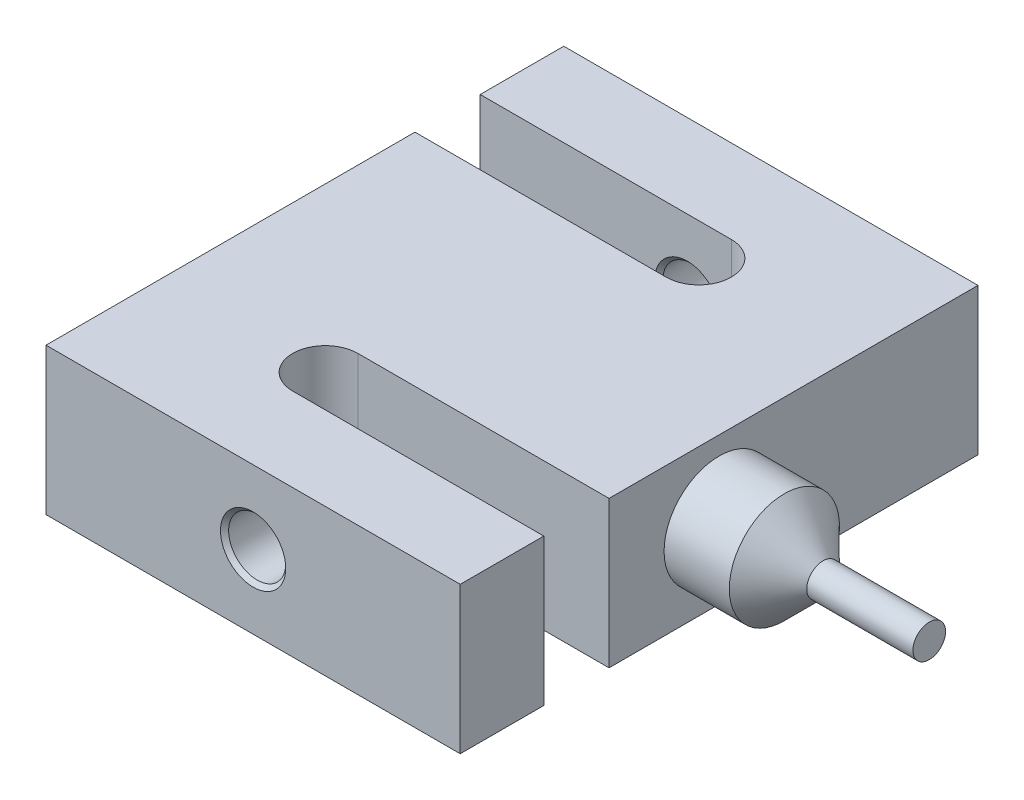
ISO-10303-21;
HEADER;
FILE_DESCRIPTION(('STEP AP214'),'2;1');
FILE_NAME('part.step','',(''),(''),'','','');
FILE_SCHEMA(('AUTOMOTIVE_DESIGN { 1 0 10303 214 1 1 1 1 }'));
ENDSEC;
DATA;
#1=APPLICATION_CONTEXT('core data for automotive mechanical design processes');
#2=APPLICATION_PROTOCOL_DEFINITION('international standard','automotive_design',2000,#1);
#3=PRODUCT_CONTEXT('',#1,'mechanical');
#4=PRODUCT('Part','Part','',(#3));
#5=PRODUCT_RELATED_PRODUCT_CATEGORY('part','',(#4));
#6=PRODUCT_DEFINITION_FORMATION('','',#4);
#7=PRODUCT_DEFINITION_CONTEXT('part definition',#1,'design');
#8=PRODUCT_DEFINITION('design','',#6,#7);
#9=PRODUCT_DEFINITION_SHAPE('','',#8);
#10=(LENGTH_UNIT() NAMED_UNIT(*) SI_UNIT(.MILLI.,.METRE.));
#11=(NAMED_UNIT(*) PLANE_ANGLE_UNIT() SI_UNIT($,.RADIAN.));
#12=(NAMED_UNIT(*) SI_UNIT($,.STERADIAN.) SOLID_ANGLE_UNIT());
#13=UNCERTAINTY_MEASURE_WITH_UNIT(LENGTH_MEASURE(1.E-05),#10,'distance_accuracy_value','');
#14=(GEOMETRIC_REPRESENTATION_CONTEXT(3) GLOBAL_UNCERTAINTY_ASSIGNED_CONTEXT((#13)) GLOBAL_UNIT_ASSIGNED_CONTEXT((#10,
#11,#12)) REPRESENTATION_CONTEXT('',''));
#15=CARTESIAN_POINT('',(0.,0.,0.));
#16=DIRECTION('',(0.,0.,1.));
#17=DIRECTION('',(1.,0.,0.));
#18=AXIS2_PLACEMENT_3D('',#15,#16,#17);
#19=CARTESIAN_POINT('',(25.4,9.,-31.75));
#20=DIRECTION('',(0.,0.,1.));
#21=DIRECTION('',(1.,0.,0.));
#22=AXIS2_PLACEMENT_3D('',#19,#20,#21);
#23=PLANE('',#22);
#24=DIRECTION('',(-1.,0.,0.));
#25=VECTOR('',#24,1.);
#26=CARTESIAN_POINT('',(25.4,-9.,-31.75));
#27=LINE('',#26,#25);
#28=CARTESIAN_POINT('',(25.4,-9.,-31.75));
#29=VERTEX_POINT('',#28);
#30=CARTESIAN_POINT('',(-25.4,-9.,-31.75));
#31=VERTEX_POINT('',#30);
#32=EDGE_CURVE('E131',#29,#31,#27,.T.);
#33=ORIENTED_EDGE('',*,*,#32,.T.);
#34=DIRECTION('',(0.,-1.,0.));
#35=VECTOR('',#34,1.);
#36=CARTESIAN_POINT('',(-25.4,9.,-31.75));
#37=LINE('',#36,#35);
#38=CARTESIAN_POINT('',(-25.4,9.,-31.75));
#39=VERTEX_POINT('',#38);
#40=EDGE_CURVE('E142',#39,#31,#37,.T.);
#41=ORIENTED_EDGE('',*,*,#40,.F.);
#42=DIRECTION('',(-1.,0.,0.));
#43=VECTOR('',#42,1.);
#44=CARTESIAN_POINT('',(25.4,9.,-31.75));
#45=LINE('',#44,#43);
#46=CARTESIAN_POINT('',(25.4,9.,-31.75));
#47=VERTEX_POINT('',#46);
#48=EDGE_CURVE('E150',#47,#39,#45,.T.);
#49=ORIENTED_EDGE('',*,*,#48,.F.);
#50=DIRECTION('',(0.,-1.,0.));
#51=VECTOR('',#50,1.);
#52=CARTESIAN_POINT('',(25.4,9.,-31.75));
#53=LINE('',#52,#51);
#54=EDGE_CURVE('E44',#47,#29,#53,.T.);
#55=ORIENTED_EDGE('',*,*,#54,.T.);
#56=EDGE_LOOP('',(#33,#41,#49,#55));
#57=FACE_BOUND('',#56,.T.);
#58=CARTESIAN_POINT('',(0.,0.,-31.75));
#59=DIRECTION('',(0.,0.,-1.));
#60=DIRECTION('',(-1.,0.,0.));
#61=AXIS2_PLACEMENT_3D('',#58,#59,#60);
#62=CIRCLE('',#61,4.);
#63=CARTESIAN_POINT('',(-4.,0.,-31.75));
#64=VERTEX_POINT('',#63);
#65=EDGE_CURVE('E170',#64,#64,#62,.T.);
#66=ORIENTED_EDGE('',*,*,#65,.F.);
#67=EDGE_LOOP('',(#66));
#68=FACE_BOUND('',#67,.T.);
#69=ADVANCED_FACE('F35',(#57,#68),#23,.F.);
#70=CARTESIAN_POINT('',(-25.4,9.,-13.5));
#71=DIRECTION('',(1.,0.,0.));
#72=DIRECTION('',(0.,0.,-1.));
#73=AXIS2_PLACEMENT_3D('',#70,#71,#72);
#74=PLANE('',#73);
#75=DIRECTION('',(0.,0.,1.));
#76=VECTOR('',#75,1.);
#77=CARTESIAN_POINT('',(-25.4,-9.,-13.5));
#78=LINE('',#77,#76);
#79=CARTESIAN_POINT('',(-25.4,-9.,-13.5));
#80=VERTEX_POINT('',#79);
#81=CARTESIAN_POINT('',(-25.4,-9.,31.75));
#82=VERTEX_POINT('',#81);
#83=EDGE_CURVE('E125',#80,#82,#78,.T.);
#84=ORIENTED_EDGE('',*,*,#83,.T.);
#85=DIRECTION('',(0.,-1.,0.));
#86=VECTOR('',#85,1.);
#87=CARTESIAN_POINT('',(-25.4,9.,31.75));
#88=LINE('',#87,#86);
#89=CARTESIAN_POINT('',(-25.4,9.,31.75));
#90=VERTEX_POINT('',#89);
#91=EDGE_CURVE('E176',#90,#82,#88,.T.);
#92=ORIENTED_EDGE('',*,*,#91,.F.);
#93=DIRECTION('',(0.,0.,1.));
#94=VECTOR('',#93,1.);
#95=CARTESIAN_POINT('',(-25.4,9.,-13.5));
#96=LINE('',#95,#94);
#97=CARTESIAN_POINT('',(-25.4,9.,-13.5));
#98=VERTEX_POINT('',#97);
#99=EDGE_CURVE('E138',#98,#90,#96,.T.);
#100=ORIENTED_EDGE('',*,*,#99,.F.);
#101=DIRECTION('',(0.,-1.,0.));
#102=VECTOR('',#101,1.);
#103=CARTESIAN_POINT('',(-25.4,9.,-13.5));
#104=LINE('',#103,#102);
#105=EDGE_CURVE('E121',#98,#80,#104,.T.);
#106=ORIENTED_EDGE('',*,*,#105,.T.);
#107=EDGE_LOOP('',(#84,#92,#100,#106));
#108=FACE_BOUND('',#107,.T.);
#109=ADVANCED_FACE('F37',(#108),#74,.F.);
#110=CARTESIAN_POINT('',(25.4,9.,0.));
#111=DIRECTION('',(-1.,0.,0.));
#112=DIRECTION('',(0.,0.,1.));
#113=AXIS2_PLACEMENT_3D('',#110,#111,#112);
#114=PLANE('',#113);
#115=CARTESIAN_POINT('',(25.4,0.,0.));
#116=DIRECTION('',(-1.,0.,0.));
#117=DIRECTION('',(0.,0.,1.));
#118=AXIS2_PLACEMENT_3D('',#115,#116,#117);
#119=CIRCLE('',#118,6.75);
#120=CARTESIAN_POINT('',(25.4,0.,6.75));
#121=VERTEX_POINT('',#120);
#122=EDGE_CURVE('E11',#121,#121,#119,.F.);
#123=ORIENTED_EDGE('',*,*,#122,.F.);
#124=EDGE_LOOP('',(#123));
#125=FACE_BOUND('',#124,.T.);
#126=DIRECTION('',(0.,0.,-1.));
#127=VECTOR('',#126,1.);
#128=CARTESIAN_POINT('',(25.4,-9.,0.));
#129=LINE('',#128,#127);
#130=CARTESIAN_POINT('',(25.4,-9.,13.5));
#131=VERTEX_POINT('',#130);
#132=EDGE_CURVE('E128',#131,#29,#129,.T.);
#133=ORIENTED_EDGE('',*,*,#132,.T.);
#134=ORIENTED_EDGE('',*,*,#54,.F.);
#135=DIRECTION('',(0.,0.,-1.));
#136=VECTOR('',#135,1.);
#137=CARTESIAN_POINT('',(25.4,9.,0.));
#138=LINE('',#137,#136);
#139=CARTESIAN_POINT('',(25.4,9.,13.5));
#140=VERTEX_POINT('',#139);
#141=EDGE_CURVE('E90',#140,#47,#138,.T.);
#142=ORIENTED_EDGE('',*,*,#141,.F.);
#143=DIRECTION('',(0.,-1.,0.));
#144=VECTOR('',#143,1.);
#145=CARTESIAN_POINT('',(25.4,9.,13.5));
#146=LINE('',#145,#144);
#147=EDGE_CURVE('E191',#140,#131,#146,.T.);
#148=ORIENTED_EDGE('',*,*,#147,.T.);
#149=EDGE_LOOP('',(#133,#134,#142,#148));
#150=FACE_BOUND('',#149,.T.);
#151=ADVANCED_FACE('F273',(#125,#150),#114,.F.);
#152=CARTESIAN_POINT('',(-25.4,9.,-31.75));
#153=DIRECTION('',(1.,0.,0.));
#154=DIRECTION('',(0.,0.,-1.));
#155=AXIS2_PLACEMENT_3D('',#152,#153,#154);
#156=PLANE('',#155);
#157=DIRECTION('',(0.,0.,1.));
#158=VECTOR('',#157,1.);
#159=CARTESIAN_POINT('',(-25.4,-9.,-31.75));
#160=LINE('',#159,#158);
#161=CARTESIAN_POINT('',(-25.4,-9.,-21.5));
#162=VERTEX_POINT('',#161);
#163=EDGE_CURVE('E133',#31,#162,#160,.T.);
#164=ORIENTED_EDGE('',*,*,#163,.T.);
#165=DIRECTION('',(0.,-1.,0.));
#166=VECTOR('',#165,1.);
#167=CARTESIAN_POINT('',(-25.4,9.,-21.5));
#168=LINE('',#167,#166);
#169=CARTESIAN_POINT('',(-25.4,9.,-21.5));
#170=VERTEX_POINT('',#169);
#171=EDGE_CURVE('E116',#170,#162,#168,.T.);
#172=ORIENTED_EDGE('',*,*,#171,.F.);
#173=DIRECTION('',(0.,0.,1.));
#174=VECTOR('',#173,1.);
#175=CARTESIAN_POINT('',(-25.4,9.,-31.75));
#176=LINE('',#175,#174);
#177=EDGE_CURVE('E107',#39,#170,#176,.T.);
#178=ORIENTED_EDGE('',*,*,#177,.F.);
#179=ORIENTED_EDGE('',*,*,#40,.T.);
#180=EDGE_LOOP('',(#164,#172,#178,#179));
#181=FACE_BOUND('',#180,.T.);
#182=ADVANCED_FACE('F160',(#181),#156,.F.);
#183=CARTESIAN_POINT('',(-25.4,9.,-21.5));
#184=DIRECTION('',(0.,0.,-1.));
#185=DIRECTION('',(-1.,0.,0.));
#186=AXIS2_PLACEMENT_3D('',#183,#184,#185);
#187=PLANE('',#186);
#188=CARTESIAN_POINT('',(0.,0.,-21.5));
#189=DIRECTION('',(0.,0.,-1.));
#190=DIRECTION('',(-1.,0.,0.));
#191=AXIS2_PLACEMENT_3D('',#188,#189,#190);
#192=CIRCLE('',#191,4.);
#193=CARTESIAN_POINT('',(-4.,0.,-21.5));
#194=VERTEX_POINT('',#193);
#195=EDGE_CURVE('E173',#194,#194,#192,.T.);
#196=ORIENTED_EDGE('',*,*,#195,.T.);
#197=EDGE_LOOP('',(#196));
#198=FACE_BOUND('',#197,.T.);
#199=DIRECTION('',(1.,0.,0.));
#200=VECTOR('',#199,1.);
#201=CARTESIAN_POINT('',(-25.4,-9.,-21.5));
#202=LINE('',#201,#200);
#203=CARTESIAN_POINT('',(5.4,-9.,-21.5));
#204=VERTEX_POINT('',#203);
#205=EDGE_CURVE('E115',#162,#204,#202,.T.);
#206=ORIENTED_EDGE('',*,*,#205,.T.);
#207=DIRECTION('',(0.,-1.,0.));
#208=VECTOR('',#207,1.);
#209=CARTESIAN_POINT('',(5.4,9.,-21.5));
#210=LINE('',#209,#208);
#211=CARTESIAN_POINT('',(5.4,9.,-21.5));
#212=VERTEX_POINT('',#211);
#213=EDGE_CURVE('E112',#212,#204,#210,.T.);
#214=ORIENTED_EDGE('',*,*,#213,.F.);
#215=DIRECTION('',(1.,0.,0.));
#216=VECTOR('',#215,1.);
#217=CARTESIAN_POINT('',(-25.4,9.,-21.5));
#218=LINE('',#217,#216);
#219=EDGE_CURVE('E101',#170,#212,#218,.T.);
#220=ORIENTED_EDGE('',*,*,#219,.F.);
#221=ORIENTED_EDGE('',*,*,#171,.T.);
#222=EDGE_LOOP('',(#206,#214,#220,#221));
#223=FACE_BOUND('',#222,.T.);
#224=ADVANCED_FACE('F113',(#198,#223),#187,.F.);
#225=CARTESIAN_POINT('',(5.4,9.,-17.5));
#226=DIRECTION('',(0.,-1.,0.));
#227=DIRECTION('',(0.,0.,-1.));
#228=AXIS2_PLACEMENT_3D('',#225,#226,#227);
#229=CYLINDRICAL_SURFACE('',#228,4.);
#230=CARTESIAN_POINT('',(5.4,-9.,-17.5));
#231=DIRECTION('',(0.,-1.,0.));
#232=DIRECTION('',(0.,0.,-1.));
#233=AXIS2_PLACEMENT_3D('',#230,#231,#232);
#234=CIRCLE('',#233,4.);
#235=CARTESIAN_POINT('',(5.4,-9.,-13.5));
#236=VERTEX_POINT('',#235);
#237=EDGE_CURVE('E76',#204,#236,#234,.T.);
#238=ORIENTED_EDGE('',*,*,#237,.T.);
#239=DIRECTION('',(0.,-1.,0.));
#240=VECTOR('',#239,1.);
#241=CARTESIAN_POINT('',(5.4,9.,-13.5));
#242=LINE('',#241,#240);
#243=CARTESIAN_POINT('',(5.4,9.,-13.5));
#244=VERTEX_POINT('',#243);
#245=EDGE_CURVE('E117',#244,#236,#242,.T.);
#246=ORIENTED_EDGE('',*,*,#245,.F.);
#247=CARTESIAN_POINT('',(5.4,9.,-17.5));
#248=DIRECTION('',(0.,-1.,0.));
#249=DIRECTION('',(0.,0.,-1.));
#250=AXIS2_PLACEMENT_3D('',#247,#248,#249);
#251=CIRCLE('',#250,4.);
#252=EDGE_CURVE('E105',#212,#244,#251,.T.);
#253=ORIENTED_EDGE('',*,*,#252,.F.);
#254=ORIENTED_EDGE('',*,*,#213,.T.);
#255=EDGE_LOOP('',(#238,#246,#253,#254));
#256=FACE_BOUND('',#255,.T.);
#257=ADVANCED_FACE('F119',(#256),#229,.F.);
#258=CARTESIAN_POINT('',(5.4,9.,-13.5));
#259=DIRECTION('',(0.,0.,1.));
#260=DIRECTION('',(1.,0.,0.));
#261=AXIS2_PLACEMENT_3D('',#258,#259,#260);
#262=PLANE('',#261);
#263=DIRECTION('',(-1.,0.,0.));
#264=VECTOR('',#263,1.);
#265=CARTESIAN_POINT('',(5.4,-9.,-13.5));
#266=LINE('',#265,#264);
#267=EDGE_CURVE('E82',#236,#80,#266,.T.);
#268=ORIENTED_EDGE('',*,*,#267,.T.);
#269=ORIENTED_EDGE('',*,*,#105,.F.);
#270=DIRECTION('',(-1.,0.,0.));
#271=VECTOR('',#270,1.);
#272=CARTESIAN_POINT('',(5.4,9.,-13.5));
#273=LINE('',#272,#271);
#274=EDGE_CURVE('E52',#244,#98,#273,.T.);
#275=ORIENTED_EDGE('',*,*,#274,.F.);
#276=ORIENTED_EDGE('',*,*,#245,.T.);
#277=EDGE_LOOP('',(#268,#269,#275,#276));
#278=FACE_BOUND('',#277,.T.);
#279=ADVANCED_FACE('F353',(#278),#262,.F.);
#280=CARTESIAN_POINT('',(5.4,9.,-17.5));
#281=DIRECTION('',(0.,-1.,0.));
#282=DIRECTION('',(0.,0.,-1.));
#283=AXIS2_PLACEMENT_3D('',#280,#281,#282);
#284=PLANE('',#283);
#285=ORIENTED_EDGE('',*,*,#99,.T.);
#286=DIRECTION('',(1.,0.,0.));
#287=VECTOR('',#286,1.);
#288=CARTESIAN_POINT('',(-25.4,9.,31.75));
#289=LINE('',#288,#287);
#290=CARTESIAN_POINT('',(25.4,9.,31.75));
#291=VERTEX_POINT('',#290);
#292=EDGE_CURVE('E197',#90,#291,#289,.T.);
#293=ORIENTED_EDGE('',*,*,#292,.T.);
#294=DIRECTION('',(0.,0.,-1.));
#295=VECTOR('',#294,1.);
#296=CARTESIAN_POINT('',(25.4,9.,31.75));
#297=LINE('',#296,#295);
#298=CARTESIAN_POINT('',(25.4,9.,21.5));
#299=VERTEX_POINT('',#298);
#300=EDGE_CURVE('E218',#291,#299,#297,.T.);
#301=ORIENTED_EDGE('',*,*,#300,.T.);
#302=DIRECTION('',(-1.,0.,0.));
#303=VECTOR('',#302,1.);
#304=CARTESIAN_POINT('',(25.4,9.,21.5));
#305=LINE('',#304,#303);
#306=CARTESIAN_POINT('',(-5.4,9.,21.5));
#307=VERTEX_POINT('',#306);
#308=EDGE_CURVE('E215',#299,#307,#305,.T.);
#309=ORIENTED_EDGE('',*,*,#308,.T.);
#310=CARTESIAN_POINT('',(-5.4,9.,17.5));
#311=DIRECTION('',(0.,-1.,0.));
#312=DIRECTION('',(0.,0.,1.));
#313=AXIS2_PLACEMENT_3D('',#310,#311,#312);
#314=CIRCLE('',#313,4.);
#315=CARTESIAN_POINT('',(-5.4,9.,13.5));
#316=VERTEX_POINT('',#315);
#317=EDGE_CURVE('E212',#307,#316,#314,.T.);
#318=ORIENTED_EDGE('',*,*,#317,.T.);
#319=DIRECTION('',(1.,0.,0.));
#320=VECTOR('',#319,1.);
#321=CARTESIAN_POINT('',(-5.4,9.,13.5));
#322=LINE('',#321,#320);
#323=EDGE_CURVE('E194',#316,#140,#322,.T.);
#324=ORIENTED_EDGE('',*,*,#323,.T.);
#325=ORIENTED_EDGE('',*,*,#141,.T.);
#326=ORIENTED_EDGE('',*,*,#48,.T.);
#327=ORIENTED_EDGE('',*,*,#177,.T.);
#328=ORIENTED_EDGE('',*,*,#219,.T.);
#329=ORIENTED_EDGE('',*,*,#252,.T.);
#330=ORIENTED_EDGE('',*,*,#274,.T.);
#331=EDGE_LOOP('',(#285,#293,#301,#309,#318,#324,#325,#326,#327,#328,#329,#330));
#332=FACE_BOUND('',#331,.T.);
#333=ADVANCED_FACE('F103',(#332),#284,.F.);
#334=CARTESIAN_POINT('',(5.4,-9.,-17.5));
#335=DIRECTION('',(0.,-1.,0.));
#336=DIRECTION('',(0.,0.,-1.));
#337=AXIS2_PLACEMENT_3D('',#334,#335,#336);
#338=PLANE('',#337);
#339=ORIENTED_EDGE('',*,*,#83,.F.);
#340=ORIENTED_EDGE('',*,*,#267,.F.);
#341=ORIENTED_EDGE('',*,*,#237,.F.);
#342=ORIENTED_EDGE('',*,*,#205,.F.);
#343=ORIENTED_EDGE('',*,*,#163,.F.);
#344=ORIENTED_EDGE('',*,*,#32,.F.);
#345=ORIENTED_EDGE('',*,*,#132,.F.);
#346=DIRECTION('',(1.,0.,0.));
#347=VECTOR('',#346,1.);
#348=CARTESIAN_POINT('',(-5.4,-9.,13.5));
#349=LINE('',#348,#347);
#350=CARTESIAN_POINT('',(-5.4,-9.,13.5));
#351=VERTEX_POINT('',#350);
#352=EDGE_CURVE('E195',#351,#131,#349,.T.);
#353=ORIENTED_EDGE('',*,*,#352,.F.);
#354=CARTESIAN_POINT('',(-5.4,-9.,17.5));
#355=DIRECTION('',(0.,-1.,0.));
#356=DIRECTION('',(0.,0.,1.));
#357=AXIS2_PLACEMENT_3D('',#354,#355,#356);
#358=CIRCLE('',#357,4.);
#359=CARTESIAN_POINT('',(-5.4,-9.,21.5));
#360=VERTEX_POINT('',#359);
#361=EDGE_CURVE('E198',#360,#351,#358,.T.);
#362=ORIENTED_EDGE('',*,*,#361,.F.);
#363=DIRECTION('',(-1.,0.,0.));
#364=VECTOR('',#363,1.);
#365=CARTESIAN_POINT('',(25.4,-9.,21.5));
#366=LINE('',#365,#364);
#367=CARTESIAN_POINT('',(25.4,-9.,21.5));
#368=VERTEX_POINT('',#367);
#369=EDGE_CURVE('E201',#368,#360,#366,.T.);
#370=ORIENTED_EDGE('',*,*,#369,.F.);
#371=DIRECTION('',(0.,0.,-1.));
#372=VECTOR('',#371,1.);
#373=CARTESIAN_POINT('',(25.4,-9.,31.75));
#374=LINE('',#373,#372);
#375=CARTESIAN_POINT('',(25.4,-9.,31.75));
#376=VERTEX_POINT('',#375);
#377=EDGE_CURVE('E204',#376,#368,#374,.T.);
#378=ORIENTED_EDGE('',*,*,#377,.F.);
#379=DIRECTION('',(1.,0.,0.));
#380=VECTOR('',#379,1.);
#381=CARTESIAN_POINT('',(-25.4,-9.,31.75));
#382=LINE('',#381,#380);
#383=EDGE_CURVE('E207',#82,#376,#382,.T.);
#384=ORIENTED_EDGE('',*,*,#383,.F.);
#385=EDGE_LOOP('',(#339,#340,#341,#342,#343,#344,#345,#353,#362,#370,#378,#384));
#386=FACE_BOUND('',#385,.T.);
#387=ADVANCED_FACE('F156',(#386),#338,.T.);
#388=CARTESIAN_POINT('',(0.,0.,-22.));
#389=DIRECTION('',(0.,0.,1.));
#390=DIRECTION('',(1.,0.,0.));
#391=AXIS2_PLACEMENT_3D('',#388,#389,#390);
#392=CONICAL_SURFACE('',#391,3.49999999999999,0.785398163397452);
#393=ORIENTED_EDGE('',*,*,#195,.F.);
#394=EDGE_LOOP('',(#393));
#395=FACE_BOUND('',#394,.T.);
#396=CARTESIAN_POINT('',(0.,0.,-22.));
#397=DIRECTION('',(0.,0.,-1.));
#398=DIRECTION('',(-1.,0.,0.));
#399=AXIS2_PLACEMENT_3D('',#396,#397,#398);
#400=CIRCLE('',#399,3.49999999999999);
#401=CARTESIAN_POINT('',(-3.49999999999999,0.,-22.));
#402=VERTEX_POINT('',#401);
#403=EDGE_CURVE('E129',#402,#402,#400,.T.);
#404=ORIENTED_EDGE('',*,*,#403,.T.);
#405=EDGE_LOOP('',(#404));
#406=FACE_BOUND('',#405,.T.);
#407=ADVANCED_FACE('F346',(#395,#406),#392,.F.);
#408=CARTESIAN_POINT('',(0.,0.,-31.75));
#409=DIRECTION('',(0.,0.,-1.));
#410=DIRECTION('',(-1.,0.,0.));
#411=AXIS2_PLACEMENT_3D('',#408,#409,#410);
#412=CYLINDRICAL_SURFACE('',#411,3.5);
#413=ORIENTED_EDGE('',*,*,#403,.F.);
#414=EDGE_LOOP('',(#413));
#415=FACE_BOUND('',#414,.T.);
#416=CARTESIAN_POINT('',(0.,0.,-31.25));
#417=DIRECTION('',(0.,0.,-1.));
#418=DIRECTION('',(-1.,0.,0.));
#419=AXIS2_PLACEMENT_3D('',#416,#417,#418);
#420=CIRCLE('',#419,3.5);
#421=CARTESIAN_POINT('',(-3.5,0.,-31.25));
#422=VERTEX_POINT('',#421);
#423=EDGE_CURVE('E167',#422,#422,#420,.T.);
#424=ORIENTED_EDGE('',*,*,#423,.T.);
#425=EDGE_LOOP('',(#424));
#426=FACE_BOUND('',#425,.T.);
#427=ADVANCED_FACE('F338',(#415,#426),#412,.F.);
#428=CARTESIAN_POINT('',(0.,0.,-31.75));
#429=DIRECTION('',(0.,0.,-1.));
#430=DIRECTION('',(-1.,0.,0.));
#431=AXIS2_PLACEMENT_3D('',#428,#429,#430);
#432=CONICAL_SURFACE('',#431,4.,0.78539816339745);
#433=ORIENTED_EDGE('',*,*,#423,.F.);
#434=EDGE_LOOP('',(#433));
#435=FACE_BOUND('',#434,.T.);
#436=ORIENTED_EDGE('',*,*,#65,.T.);
#437=EDGE_LOOP('',(#436));
#438=FACE_BOUND('',#437,.T.);
#439=ADVANCED_FACE('F330',(#435,#438),#432,.F.);
#440=CARTESIAN_POINT('',(-25.4,9.,31.75));
#441=DIRECTION('',(0.,0.,-1.));
#442=DIRECTION('',(-1.,0.,0.));
#443=AXIS2_PLACEMENT_3D('',#440,#441,#442);
#444=PLANE('',#443);
#445=CARTESIAN_POINT('',(0.,0.,31.75));
#446=DIRECTION('',(0.,0.,1.));
#447=DIRECTION('',(1.,0.,0.));
#448=AXIS2_PLACEMENT_3D('',#445,#446,#447);
#449=CIRCLE('',#448,4.);
#450=CARTESIAN_POINT('',(4.,0.,31.75));
#451=VERTEX_POINT('',#450);
#452=EDGE_CURVE('E228',#451,#451,#449,.T.);
#453=ORIENTED_EDGE('',*,*,#452,.F.);
#454=EDGE_LOOP('',(#453));
#455=FACE_BOUND('',#454,.T.);
#456=ORIENTED_EDGE('',*,*,#383,.T.);
#457=DIRECTION('',(0.,-1.,0.));
#458=VECTOR('',#457,1.);
#459=CARTESIAN_POINT('',(25.4,9.,31.75));
#460=LINE('',#459,#458);
#461=EDGE_CURVE('E179',#291,#376,#460,.T.);
#462=ORIENTED_EDGE('',*,*,#461,.F.);
#463=ORIENTED_EDGE('',*,*,#292,.F.);
#464=ORIENTED_EDGE('',*,*,#91,.T.);
#465=EDGE_LOOP('',(#456,#462,#463,#464));
#466=FACE_BOUND('',#465,.T.);
#467=ADVANCED_FACE('F328',(#455,#466),#444,.F.);
#468=CARTESIAN_POINT('',(25.4,9.,31.75));
#469=DIRECTION('',(-1.,0.,0.));
#470=DIRECTION('',(0.,0.,1.));
#471=AXIS2_PLACEMENT_3D('',#468,#469,#470);
#472=PLANE('',#471);
#473=ORIENTED_EDGE('',*,*,#377,.T.);
#474=DIRECTION('',(0.,-1.,0.));
#475=VECTOR('',#474,1.);
#476=CARTESIAN_POINT('',(25.4,9.,21.5));
#477=LINE('',#476,#475);
#478=EDGE_CURVE('E182',#299,#368,#477,.T.);
#479=ORIENTED_EDGE('',*,*,#478,.F.);
#480=ORIENTED_EDGE('',*,*,#300,.F.);
#481=ORIENTED_EDGE('',*,*,#461,.T.);
#482=EDGE_LOOP('',(#473,#479,#480,#481));
#483=FACE_BOUND('',#482,.T.);
#484=ADVANCED_FACE('F318',(#483),#472,.F.);
#485=CARTESIAN_POINT('',(25.4,9.,21.5));
#486=DIRECTION('',(0.,0.,1.));
#487=DIRECTION('',(1.,0.,0.));
#488=AXIS2_PLACEMENT_3D('',#485,#486,#487);
#489=PLANE('',#488);
#490=CARTESIAN_POINT('',(0.,0.,21.5));
#491=DIRECTION('',(0.,0.,1.));
#492=DIRECTION('',(1.,0.,0.));
#493=AXIS2_PLACEMENT_3D('',#490,#491,#492);
#494=CIRCLE('',#493,4.);
#495=CARTESIAN_POINT('',(4.,0.,21.5));
#496=VERTEX_POINT('',#495);
#497=EDGE_CURVE('E231',#496,#496,#494,.T.);
#498=ORIENTED_EDGE('',*,*,#497,.T.);
#499=EDGE_LOOP('',(#498));
#500=FACE_BOUND('',#499,.T.);
#501=ORIENTED_EDGE('',*,*,#369,.T.);
#502=DIRECTION('',(0.,-1.,0.));
#503=VECTOR('',#502,1.);
#504=CARTESIAN_POINT('',(-5.4,9.,21.5));
#505=LINE('',#504,#503);
#506=EDGE_CURVE('E185',#307,#360,#505,.T.);
#507=ORIENTED_EDGE('',*,*,#506,.F.);
#508=ORIENTED_EDGE('',*,*,#308,.F.);
#509=ORIENTED_EDGE('',*,*,#478,.T.);
#510=EDGE_LOOP('',(#501,#507,#508,#509));
#511=FACE_BOUND('',#510,.T.);
#512=ADVANCED_FACE('F312',(#500,#511),#489,.F.);
#513=CARTESIAN_POINT('',(-5.4,9.,17.5));
#514=DIRECTION('',(0.,-1.,0.));
#515=DIRECTION('',(0.,0.,-1.));
#516=AXIS2_PLACEMENT_3D('',#513,#514,#515);
#517=CYLINDRICAL_SURFACE('',#516,4.);
#518=ORIENTED_EDGE('',*,*,#361,.T.);
#519=DIRECTION('',(0.,-1.,0.));
#520=VECTOR('',#519,1.);
#521=CARTESIAN_POINT('',(-5.4,9.,13.5));
#522=LINE('',#521,#520);
#523=EDGE_CURVE('E188',#316,#351,#522,.T.);
#524=ORIENTED_EDGE('',*,*,#523,.F.);
#525=ORIENTED_EDGE('',*,*,#317,.F.);
#526=ORIENTED_EDGE('',*,*,#506,.T.);
#527=EDGE_LOOP('',(#518,#524,#525,#526));
#528=FACE_BOUND('',#527,.T.);
#529=ADVANCED_FACE('F305',(#528),#517,.F.);
#530=CARTESIAN_POINT('',(-5.4,9.,13.5));
#531=DIRECTION('',(0.,0.,-1.));
#532=DIRECTION('',(-1.,0.,0.));
#533=AXIS2_PLACEMENT_3D('',#530,#531,#532);
#534=PLANE('',#533);
#535=ORIENTED_EDGE('',*,*,#352,.T.);
#536=ORIENTED_EDGE('',*,*,#147,.F.);
#537=ORIENTED_EDGE('',*,*,#323,.F.);
#538=ORIENTED_EDGE('',*,*,#523,.T.);
#539=EDGE_LOOP('',(#535,#536,#537,#538));
#540=FACE_BOUND('',#539,.T.);
#541=ADVANCED_FACE('F288',(#540),#534,.F.);
#542=CARTESIAN_POINT('',(0.,0.,22.));
#543=DIRECTION('',(0.,0.,-1.));
#544=DIRECTION('',(-1.,0.,0.));
#545=AXIS2_PLACEMENT_3D('',#542,#543,#544);
#546=CONICAL_SURFACE('',#545,3.49999999999999,0.785398163397452);
#547=ORIENTED_EDGE('',*,*,#497,.F.);
#548=EDGE_LOOP('',(#547));
#549=FACE_BOUND('',#548,.T.);
#550=CARTESIAN_POINT('',(0.,0.,22.));
#551=DIRECTION('',(0.,0.,1.));
#552=DIRECTION('',(1.,0.,0.));
#553=AXIS2_PLACEMENT_3D('',#550,#551,#552);
#554=CIRCLE('',#553,3.49999999999999);
#555=CARTESIAN_POINT('',(3.49999999999999,0.,22.));
#556=VERTEX_POINT('',#555);
#557=EDGE_CURVE('E210',#556,#556,#554,.T.);
#558=ORIENTED_EDGE('',*,*,#557,.T.);
#559=EDGE_LOOP('',(#558));
#560=FACE_BOUND('',#559,.T.);
#561=ADVANCED_FACE('F465',(#549,#560),#546,.F.);
#562=CARTESIAN_POINT('',(0.,0.,31.75));
#563=DIRECTION('',(0.,0.,1.));
#564=DIRECTION('',(1.,0.,0.));
#565=AXIS2_PLACEMENT_3D('',#562,#563,#564);
#566=CYLINDRICAL_SURFACE('',#565,3.5);
#567=ORIENTED_EDGE('',*,*,#557,.F.);
#568=EDGE_LOOP('',(#567));
#569=FACE_BOUND('',#568,.T.);
#570=CARTESIAN_POINT('',(0.,0.,31.25));
#571=DIRECTION('',(0.,0.,1.));
#572=DIRECTION('',(1.,0.,0.));
#573=AXIS2_PLACEMENT_3D('',#570,#571,#572);
#574=CIRCLE('',#573,3.5);
#575=CARTESIAN_POINT('',(3.5,0.,31.25));
#576=VERTEX_POINT('',#575);
#577=EDGE_CURVE('E225',#576,#576,#574,.T.);
#578=ORIENTED_EDGE('',*,*,#577,.T.);
#579=EDGE_LOOP('',(#578));
#580=FACE_BOUND('',#579,.T.);
#581=ADVANCED_FACE('F265',(#569,#580),#566,.F.);
#582=CARTESIAN_POINT('',(0.,0.,31.75));
#583=DIRECTION('',(0.,0.,1.));
#584=DIRECTION('',(1.,0.,0.));
#585=AXIS2_PLACEMENT_3D('',#582,#583,#584);
#586=CONICAL_SURFACE('',#585,4.,0.78539816339745);
#587=ORIENTED_EDGE('',*,*,#577,.F.);
#588=EDGE_LOOP('',(#587));
#589=FACE_BOUND('',#588,.T.);
#590=ORIENTED_EDGE('',*,*,#452,.T.);
#591=EDGE_LOOP('',(#590));
#592=FACE_BOUND('',#591,.T.);
#593=ADVANCED_FACE('F260',(#589,#592),#586,.F.);
#594=CARTESIAN_POINT('',(51.1712251779693,0.,0.));
#595=DIRECTION('',(-1.,0.,0.));
#596=DIRECTION('',(0.,0.,1.));
#597=AXIS2_PLACEMENT_3D('',#594,#595,#596);
#598=PLANE('',#597);
#599=CARTESIAN_POINT('',(51.1712251779693,0.,0.));
#600=DIRECTION('',(-1.,0.,0.));
#601=DIRECTION('',(0.,0.,1.));
#602=AXIS2_PLACEMENT_3D('',#599,#600,#601);
#603=CIRCLE('',#602,2.);
#604=CARTESIAN_POINT('',(51.1712251779693,0.,2.));
#605=VERTEX_POINT('',#604);
#606=EDGE_CURVE('E234',#605,#605,#603,.T.);
#607=ORIENTED_EDGE('',*,*,#606,.F.);
#608=EDGE_LOOP('',(#607));
#609=FACE_BOUND('',#608,.T.);
#610=ADVANCED_FACE('F255',(#609),#598,.F.);
#611=CARTESIAN_POINT('',(-80.9,0.,0.));
#612=DIRECTION('',(-1.,0.,0.));
#613=DIRECTION('',(0.,0.,1.));
#614=AXIS2_PLACEMENT_3D('',#611,#612,#613);
#615=CYLINDRICAL_SURFACE('',#614,2.);
#616=CARTESIAN_POINT('',(38.15,0.,0.));
#617=DIRECTION('',(-1.,0.,0.));
#618=DIRECTION('',(0.,0.,1.));
#619=AXIS2_PLACEMENT_3D('',#616,#617,#618);
#620=CIRCLE('',#619,2.);
#621=CARTESIAN_POINT('',(38.15,0.,2.));
#622=VERTEX_POINT('',#621);
#623=EDGE_CURVE('E237',#622,#622,#620,.T.);
#624=ORIENTED_EDGE('',*,*,#623,.F.);
#625=EDGE_LOOP('',(#624));
#626=FACE_BOUND('',#625,.T.);
#627=ORIENTED_EDGE('',*,*,#606,.T.);
#628=EDGE_LOOP('',(#627));
#629=FACE_BOUND('',#628,.T.);
#630=ADVANCED_FACE('F249',(#626,#629),#615,.T.);
#631=CARTESIAN_POINT('',(38.15,0.,0.));
#632=DIRECTION('',(-1.,0.,0.));
#633=DIRECTION('',(0.,0.,1.));
#634=AXIS2_PLACEMENT_3D('',#631,#632,#633);
#635=CONICAL_SURFACE('',#634,2.,0.78539816339745);
#636=CARTESIAN_POINT('',(33.4,0.,0.));
#637=DIRECTION('',(-1.,0.,0.));
#638=DIRECTION('',(0.,0.,1.));
#639=AXIS2_PLACEMENT_3D('',#636,#637,#638);
#640=CIRCLE('',#639,6.75);
#641=CARTESIAN_POINT('',(33.4,0.,6.75));
#642=VERTEX_POINT('',#641);
#643=EDGE_CURVE('E240',#642,#642,#640,.T.);
#644=CARTESIAN_POINT('',(33.4,0.,6.75));
#645=CARTESIAN_POINT('',(33.4494791666667,0.,6.70052083333333));
#646=CARTESIAN_POINT('',(33.4989583333333,0.,6.65104166666666));
#647=CARTESIAN_POINT('',(33.5979166666667,0.,6.55208333333333));
#648=CARTESIAN_POINT('',(33.6473958333333,0.,6.50260416666667));
#649=CARTESIAN_POINT('',(33.7463541666667,0.,6.40364583333333));
#650=CARTESIAN_POINT('',(33.7958333333333,0.,6.35416666666667));
#651=CARTESIAN_POINT('',(33.8947916666667,0.,6.25520833333333));
#652=CARTESIAN_POINT('',(33.9442708333333,0.,6.20572916666667));
#653=CARTESIAN_POINT('',(34.0432291666667,0.,6.10677083333333));
#654=CARTESIAN_POINT('',(34.0927083333333,0.,6.05729166666667));
#655=CARTESIAN_POINT('',(34.1916666666667,0.,5.95833333333333));
#656=CARTESIAN_POINT('',(34.2411458333333,0.,5.90885416666666));
#657=CARTESIAN_POINT('',(34.3401041666667,0.,5.80989583333333));
#658=CARTESIAN_POINT('',(34.3895833333333,0.,5.76041666666666));
#659=CARTESIAN_POINT('',(34.4885416666667,0.,5.66145833333333));
#660=CARTESIAN_POINT('',(34.5380208333333,0.,5.61197916666666));
#661=CARTESIAN_POINT('',(34.6369791666667,0.,5.51302083333333));
#662=CARTESIAN_POINT('',(34.6864583333333,0.,5.46354166666666));
#663=CARTESIAN_POINT('',(34.7854166666667,0.,5.36458333333333));
#664=CARTESIAN_POINT('',(34.8348958333333,0.,5.31510416666667));
#665=CARTESIAN_POINT('',(34.9338541666667,0.,5.21614583333333));
#666=CARTESIAN_POINT('',(34.9833333333333,0.,5.16666666666666));
#667=CARTESIAN_POINT('',(35.0822916666667,0.,5.06770833333333));
#668=CARTESIAN_POINT('',(35.1317708333333,0.,5.01822916666666));
#669=CARTESIAN_POINT('',(35.2307291666667,0.,4.91927083333333));
#670=CARTESIAN_POINT('',(35.2802083333333,0.,4.86979166666666));
#671=CARTESIAN_POINT('',(35.3791666666667,0.,4.77083333333333));
#672=CARTESIAN_POINT('',(35.4286458333333,0.,4.72135416666666));
#673=CARTESIAN_POINT('',(35.5276041666667,0.,4.62239583333333));
#674=CARTESIAN_POINT('',(35.5770833333333,0.,4.57291666666666));
#675=CARTESIAN_POINT('',(35.6760416666667,0.,4.47395833333333));
#676=CARTESIAN_POINT('',(35.7255208333333,0.,4.42447916666666));
#677=CARTESIAN_POINT('',(35.8244791666667,0.,4.32552083333333));
#678=CARTESIAN_POINT('',(35.8739583333333,0.,4.27604166666666));
#679=CARTESIAN_POINT('',(35.9729166666667,0.,4.17708333333333));
#680=CARTESIAN_POINT('',(36.0223958333333,0.,4.12760416666666));
#681=CARTESIAN_POINT('',(36.1213541666667,0.,4.02864583333333));
#682=CARTESIAN_POINT('',(36.1708333333333,0.,3.97916666666666));
#683=CARTESIAN_POINT('',(36.2697916666667,0.,3.88020833333333));
#684=CARTESIAN_POINT('',(36.3192708333333,0.,3.83072916666666));
#685=CARTESIAN_POINT('',(36.4182291666667,0.,3.73177083333333));
#686=CARTESIAN_POINT('',(36.4677083333333,0.,3.68229166666666));
#687=CARTESIAN_POINT('',(36.5666666666667,0.,3.58333333333333));
#688=CARTESIAN_POINT('',(36.6161458333333,0.,3.53385416666666));
#689=CARTESIAN_POINT('',(36.7151041666667,0.,3.43489583333333));
#690=CARTESIAN_POINT('',(36.7645833333333,0.,3.38541666666666));
#691=CARTESIAN_POINT('',(36.8635416666667,0.,3.28645833333333));
#692=CARTESIAN_POINT('',(36.9130208333333,0.,3.23697916666666));
#693=CARTESIAN_POINT('',(37.0119791666667,0.,3.13802083333333));
#694=CARTESIAN_POINT('',(37.0614583333333,0.,3.08854166666666));
#695=CARTESIAN_POINT('',(37.1604166666667,0.,2.98958333333333));
#696=CARTESIAN_POINT('',(37.2098958333333,0.,2.94010416666666));
#697=CARTESIAN_POINT('',(37.3088541666667,0.,2.84114583333333));
#698=CARTESIAN_POINT('',(37.3583333333333,0.,2.79166666666666));
#699=CARTESIAN_POINT('',(37.4572916666667,0.,2.69270833333333));
#700=CARTESIAN_POINT('',(37.5067708333333,0.,2.64322916666666));
#701=CARTESIAN_POINT('',(37.6057291666667,0.,2.54427083333333));
#702=CARTESIAN_POINT('',(37.6552083333333,0.,2.49479166666666));
#703=CARTESIAN_POINT('',(37.7541666666667,0.,2.39583333333333));
#704=CARTESIAN_POINT('',(37.8036458333333,0.,2.34635416666666));
#705=CARTESIAN_POINT('',(37.9026041666667,0.,2.24739583333333));
#706=CARTESIAN_POINT('',(37.9520833333333,0.,2.19791666666666));
#707=CARTESIAN_POINT('',(38.0510416666667,0.,2.09895833333333));
#708=CARTESIAN_POINT('',(38.1005208333333,0.,2.04947916666666));
#709=CARTESIAN_POINT('',(38.15,0.,2.));
#710=B_SPLINE_CURVE_WITH_KNOTS('',3,(#644,#645,#646,#647,#648,#649,#650,#651,#652,#653,#654,
#655,#656,#657,#658,#659,#660,#661,#662,#663,#664,#665,#666,#667,#668,#669,#670,#671,#672,#673,
#674,#675,#676,#677,#678,#679,#680,#681,#682,#683,#684,#685,#686,#687,#688,#689,#690,#691,#692,
#693,#694,#695,#696,#697,#698,#699,#700,#701,#702,#703,#704,#705,#706,#707,#708,#709),
.UNSPECIFIED.,.F.,.F.,(4,2,2,2,2,2,2,2,2,2,2,2,2,2,2,2,2,2,2,2,2,2,2,2,2,2,2,2,2,2,2,2,4),(0.,
0.209922325664758,0.419844651329514,0.629766976994272,0.839689302659028,1.04961162832379,
1.25953395398854,1.4694562796533,1.67937860531805,1.88930093098281,2.09922325664757,
2.30914558231232,2.51906790797708,2.72899023364183,2.93891255930659,3.14883488497135,
3.3587572106361,3.56867953630086,3.77860186196561,3.98852418763037,4.19844651329513,
4.40836883895988,4.61829116462464,4.82821349028939,5.03813581595415,5.24805814161891,
5.45798046728366,5.66790279294842,5.87782511861317,6.08774744427793,6.29766976994269,
6.50759209560745,6.7175144212722),.UNSPECIFIED.);
#711=EDGE_CURVE('BSEAM246',#642,#622,#710,.T.);
#712=ORIENTED_EDGE('',*,*,#643,.F.);
#713=ORIENTED_EDGE('',*,*,#623,.T.);
#714=ORIENTED_EDGE('',*,*,#711,.T.);
#715=ORIENTED_EDGE('',*,*,#711,.F.);
#716=EDGE_LOOP('',(#712,#714,#713,#715));
#717=FACE_BOUND('',#716,.T.);
#718=ADVANCED_FACE('F246',(#717),#635,.T.);
#719=CARTESIAN_POINT('',(-80.9,0.,0.));
#720=DIRECTION('',(-1.,0.,0.));
#721=DIRECTION('',(0.,0.,1.));
#722=AXIS2_PLACEMENT_3D('',#719,#720,#721);
#723=CYLINDRICAL_SURFACE('',#722,6.75);
#724=ORIENTED_EDGE('',*,*,#122,.T.);
#725=EDGE_LOOP('',(#724));
#726=FACE_BOUND('',#725,.T.);
#727=ORIENTED_EDGE('',*,*,#643,.T.);
#728=EDGE_LOOP('',(#727));
#729=FACE_BOUND('',#728,.T.);
#730=ADVANCED_FACE('F244',(#726,#729),#723,.T.);
#731=CLOSED_SHELL('',(#69,#109,#151,#182,#224,#257,#279,#333,#387,#407,#427,#439,#467,#484,#512,
#529,#541,#561,#581,#593,#610,#630,#718,#730));
#732=MANIFOLD_SOLID_BREP('B2',#731);
#733=ADVANCED_BREP_SHAPE_REPRESENTATION('',(#18,#732),#14);
#734=SHAPE_DEFINITION_REPRESENTATION(#9,#733);
ENDSEC;
END-ISO-10303-21;
